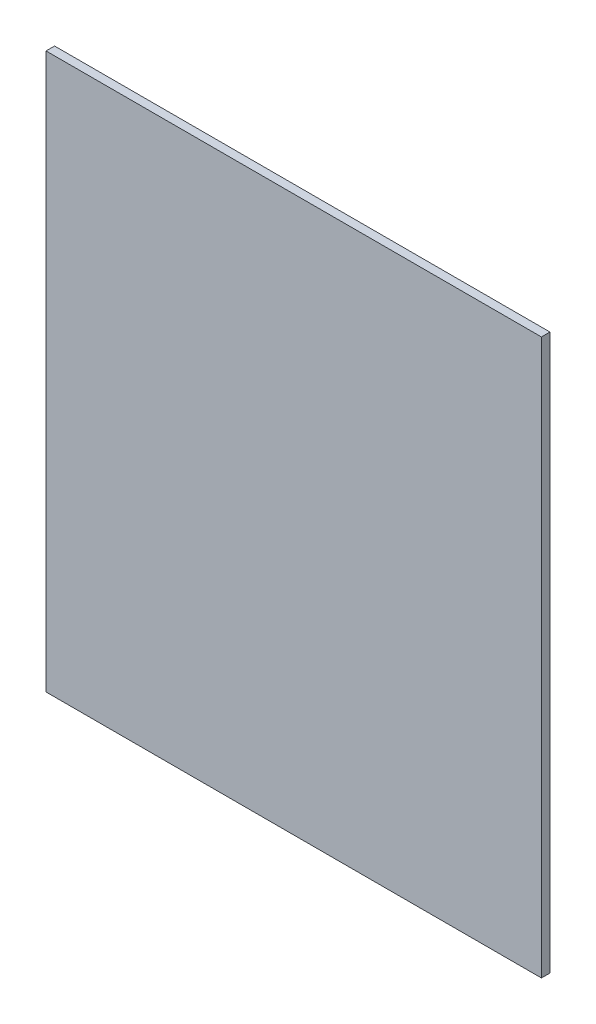
ISO-10303-21;
HEADER;
FILE_DESCRIPTION(('STEP AP214'),'2;1');
FILE_NAME('part.step','',(''),(''),'','','');
FILE_SCHEMA(('AUTOMOTIVE_DESIGN { 1 0 10303 214 1 1 1 1 }'));
ENDSEC;
DATA;
#1=APPLICATION_CONTEXT('core data for automotive mechanical design processes');
#2=APPLICATION_PROTOCOL_DEFINITION('international standard','automotive_design',2000,#1);
#3=PRODUCT_CONTEXT('',#1,'mechanical');
#4=PRODUCT('Part','Part','',(#3));
#5=PRODUCT_RELATED_PRODUCT_CATEGORY('part','',(#4));
#6=PRODUCT_DEFINITION_FORMATION('','',#4);
#7=PRODUCT_DEFINITION_CONTEXT('part definition',#1,'design');
#8=PRODUCT_DEFINITION('design','',#6,#7);
#9=PRODUCT_DEFINITION_SHAPE('','',#8);
#10=(LENGTH_UNIT() NAMED_UNIT(*) SI_UNIT(.MILLI.,.METRE.));
#11=(NAMED_UNIT(*) PLANE_ANGLE_UNIT() SI_UNIT($,.RADIAN.));
#12=(NAMED_UNIT(*) SI_UNIT($,.STERADIAN.) SOLID_ANGLE_UNIT());
#13=UNCERTAINTY_MEASURE_WITH_UNIT(LENGTH_MEASURE(1.E-05),#10,'distance_accuracy_value','');
#14=(GEOMETRIC_REPRESENTATION_CONTEXT(3) GLOBAL_UNCERTAINTY_ASSIGNED_CONTEXT((#13)) GLOBAL_UNIT_ASSIGNED_CONTEXT((#10,
#11,#12)) REPRESENTATION_CONTEXT('',''));
#15=CARTESIAN_POINT('',(0.,0.,0.));
#16=DIRECTION('',(0.,0.,1.));
#17=DIRECTION('',(1.,0.,0.));
#18=AXIS2_PLACEMENT_3D('',#15,#16,#17);
#19=CARTESIAN_POINT('',(0.,0.,2.));
#20=DIRECTION('',(1.,0.,0.));
#21=DIRECTION('',(0.,0.,-1.));
#22=AXIS2_PLACEMENT_3D('',#19,#20,#21);
#23=PLANE('',#22);
#24=DIRECTION('',(0.,-1.,0.));
#25=VECTOR('',#24,1.);
#26=CARTESIAN_POINT('',(0.,0.,0.));
#27=LINE('',#26,#25);
#28=CARTESIAN_POINT('',(0.,130.,0.));
#29=VERTEX_POINT('',#28);
#30=CARTESIAN_POINT('',(0.,0.,0.));
#31=VERTEX_POINT('',#30);
#32=EDGE_CURVE('E100',#29,#31,#27,.T.);
#33=ORIENTED_EDGE('',*,*,#32,.T.);
#34=DIRECTION('',(0.,0.,-1.));
#35=VECTOR('',#34,1.);
#36=CARTESIAN_POINT('',(0.,0.,2.));
#37=LINE('',#36,#35);
#38=CARTESIAN_POINT('',(0.,0.,2.));
#39=VERTEX_POINT('',#38);
#40=EDGE_CURVE('E11',#39,#31,#37,.T.);
#41=ORIENTED_EDGE('',*,*,#40,.F.);
#42=DIRECTION('',(0.,-1.,0.));
#43=VECTOR('',#42,1.);
#44=CARTESIAN_POINT('',(0.,0.,2.));
#45=LINE('',#44,#43);
#46=CARTESIAN_POINT('',(0.,130.,2.));
#47=VERTEX_POINT('',#46);
#48=EDGE_CURVE('E88',#47,#39,#45,.T.);
#49=ORIENTED_EDGE('',*,*,#48,.F.);
#50=DIRECTION('',(0.,0.,-1.));
#51=VECTOR('',#50,1.);
#52=CARTESIAN_POINT('',(0.,130.,2.));
#53=LINE('',#52,#51);
#54=EDGE_CURVE('E96',#47,#29,#53,.T.);
#55=ORIENTED_EDGE('',*,*,#54,.T.);
#56=EDGE_LOOP('',(#33,#41,#49,#55));
#57=FACE_BOUND('',#56,.T.);
#58=ADVANCED_FACE('F37',(#57),#23,.F.);
#59=CARTESIAN_POINT('',(0.,0.,2.));
#60=DIRECTION('',(0.,1.,0.));
#61=DIRECTION('',(0.,0.,1.));
#62=AXIS2_PLACEMENT_3D('',#59,#60,#61);
#63=PLANE('',#62);
#64=DIRECTION('',(1.,0.,0.));
#65=VECTOR('',#64,1.);
#66=CARTESIAN_POINT('',(0.,0.,0.));
#67=LINE('',#66,#65);
#68=CARTESIAN_POINT('',(116.,0.,0.));
#69=VERTEX_POINT('',#68);
#70=EDGE_CURVE('E92',#31,#69,#67,.T.);
#71=ORIENTED_EDGE('',*,*,#70,.T.);
#72=DIRECTION('',(0.,0.,-1.));
#73=VECTOR('',#72,1.);
#74=CARTESIAN_POINT('',(116.,0.,2.));
#75=LINE('',#74,#73);
#76=CARTESIAN_POINT('',(116.,0.,2.));
#77=VERTEX_POINT('',#76);
#78=EDGE_CURVE('E45',#77,#69,#75,.T.);
#79=ORIENTED_EDGE('',*,*,#78,.F.);
#80=DIRECTION('',(1.,0.,0.));
#81=VECTOR('',#80,1.);
#82=CARTESIAN_POINT('',(0.,0.,2.));
#83=LINE('',#82,#81);
#84=EDGE_CURVE('E83',#39,#77,#83,.T.);
#85=ORIENTED_EDGE('',*,*,#84,.F.);
#86=ORIENTED_EDGE('',*,*,#40,.T.);
#87=EDGE_LOOP('',(#71,#79,#85,#86));
#88=FACE_BOUND('',#87,.T.);
#89=ADVANCED_FACE('F91',(#88),#63,.F.);
#90=CARTESIAN_POINT('',(116.,0.,2.));
#91=DIRECTION('',(-1.,0.,0.));
#92=DIRECTION('',(0.,0.,1.));
#93=AXIS2_PLACEMENT_3D('',#90,#91,#92);
#94=PLANE('',#93);
#95=DIRECTION('',(0.,1.,0.));
#96=VECTOR('',#95,1.);
#97=CARTESIAN_POINT('',(116.,0.,0.));
#98=LINE('',#97,#96);
#99=CARTESIAN_POINT('',(116.,130.,0.));
#100=VERTEX_POINT('',#99);
#101=EDGE_CURVE('E70',#69,#100,#98,.T.);
#102=ORIENTED_EDGE('',*,*,#101,.T.);
#103=DIRECTION('',(0.,0.,-1.));
#104=VECTOR('',#103,1.);
#105=CARTESIAN_POINT('',(116.,130.,2.));
#106=LINE('',#105,#104);
#107=CARTESIAN_POINT('',(116.,130.,2.));
#108=VERTEX_POINT('',#107);
#109=EDGE_CURVE('E93',#108,#100,#106,.T.);
#110=ORIENTED_EDGE('',*,*,#109,.F.);
#111=DIRECTION('',(0.,1.,0.));
#112=VECTOR('',#111,1.);
#113=CARTESIAN_POINT('',(116.,0.,2.));
#114=LINE('',#113,#112);
#115=EDGE_CURVE('E86',#77,#108,#114,.T.);
#116=ORIENTED_EDGE('',*,*,#115,.F.);
#117=ORIENTED_EDGE('',*,*,#78,.T.);
#118=EDGE_LOOP('',(#102,#110,#116,#117));
#119=FACE_BOUND('',#118,.T.);
#120=ADVANCED_FACE('F94',(#119),#94,.F.);
#121=CARTESIAN_POINT('',(0.,130.,2.));
#122=DIRECTION('',(0.,-1.,0.));
#123=DIRECTION('',(0.,0.,-1.));
#124=AXIS2_PLACEMENT_3D('',#121,#122,#123);
#125=PLANE('',#124);
#126=DIRECTION('',(-1.,0.,0.));
#127=VECTOR('',#126,1.);
#128=CARTESIAN_POINT('',(0.,130.,0.));
#129=LINE('',#128,#127);
#130=EDGE_CURVE('E76',#100,#29,#129,.T.);
#131=ORIENTED_EDGE('',*,*,#130,.T.);
#132=ORIENTED_EDGE('',*,*,#54,.F.);
#133=DIRECTION('',(-1.,0.,0.));
#134=VECTOR('',#133,1.);
#135=CARTESIAN_POINT('',(0.,130.,2.));
#136=LINE('',#135,#134);
#137=EDGE_CURVE('E53',#108,#47,#136,.T.);
#138=ORIENTED_EDGE('',*,*,#137,.F.);
#139=ORIENTED_EDGE('',*,*,#109,.T.);
#140=EDGE_LOOP('',(#131,#132,#138,#139));
#141=FACE_BOUND('',#140,.T.);
#142=ADVANCED_FACE('F107',(#141),#125,.F.);
#143=CARTESIAN_POINT('',(0.,0.,2.));
#144=DIRECTION('',(0.,0.,-1.));
#145=DIRECTION('',(-1.,0.,0.));
#146=AXIS2_PLACEMENT_3D('',#143,#144,#145);
#147=PLANE('',#146);
#148=ORIENTED_EDGE('',*,*,#48,.T.);
#149=ORIENTED_EDGE('',*,*,#84,.T.);
#150=ORIENTED_EDGE('',*,*,#115,.T.);
#151=ORIENTED_EDGE('',*,*,#137,.T.);
#152=EDGE_LOOP('',(#148,#149,#150,#151));
#153=FACE_BOUND('',#152,.T.);
#154=ADVANCED_FACE('F84',(#153),#147,.F.);
#155=CARTESIAN_POINT('',(0.,0.,0.));
#156=DIRECTION('',(0.,0.,-1.));
#157=DIRECTION('',(-1.,0.,0.));
#158=AXIS2_PLACEMENT_3D('',#155,#156,#157);
#159=PLANE('',#158);
#160=ORIENTED_EDGE('',*,*,#32,.F.);
#161=ORIENTED_EDGE('',*,*,#130,.F.);
#162=ORIENTED_EDGE('',*,*,#101,.F.);
#163=ORIENTED_EDGE('',*,*,#70,.F.);
#164=EDGE_LOOP('',(#160,#161,#162,#163));
#165=FACE_BOUND('',#164,.T.);
#166=ADVANCED_FACE('F110',(#165),#159,.T.);
#167=CLOSED_SHELL('',(#58,#89,#120,#142,#154,#166));
#168=MANIFOLD_SOLID_BREP('B2',#167);
#169=ADVANCED_BREP_SHAPE_REPRESENTATION('',(#18,#168),#14);
#170=SHAPE_DEFINITION_REPRESENTATION(#9,#169);
ENDSEC;
END-ISO-10303-21;
